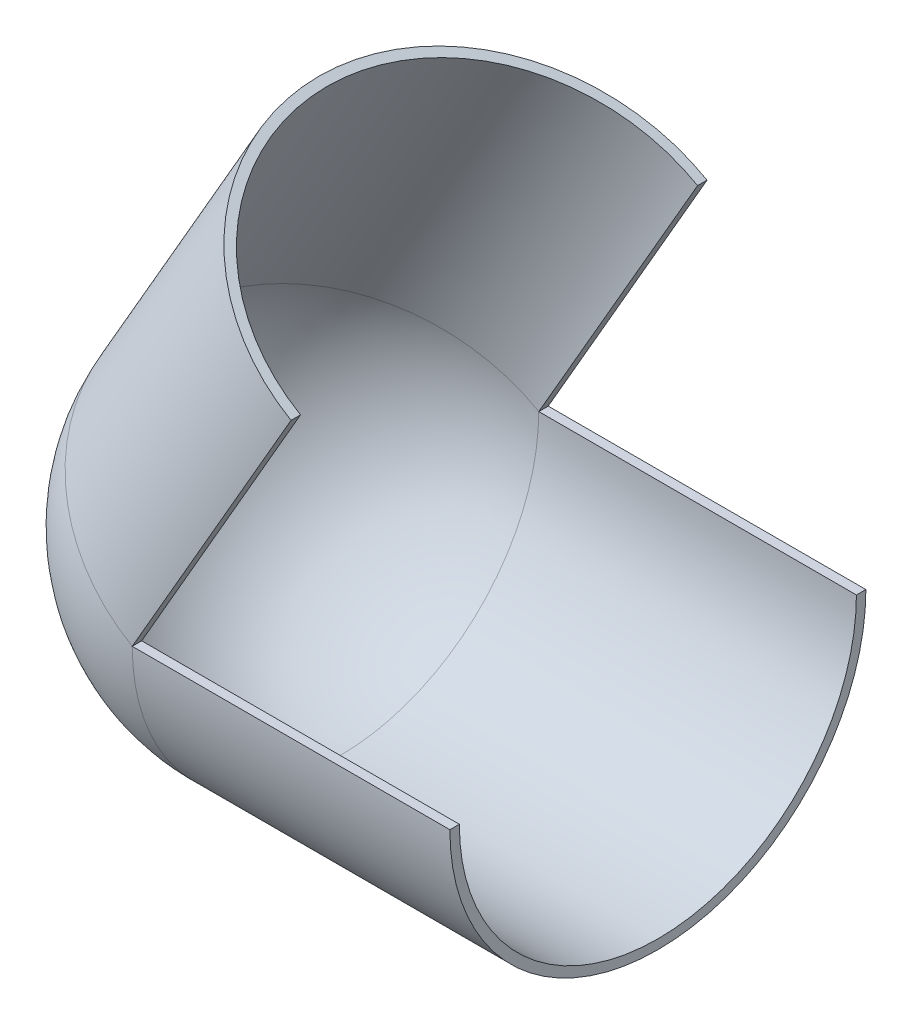
ISO-10303-21;
HEADER;
FILE_DESCRIPTION(('STEP AP214'),'2;1');
FILE_NAME('part.step','',(''),(''),'','','');
FILE_SCHEMA(('AUTOMOTIVE_DESIGN { 1 0 10303 214 1 1 1 1 }'));
ENDSEC;
DATA;
#1=APPLICATION_CONTEXT('core data for automotive mechanical design processes');
#2=APPLICATION_PROTOCOL_DEFINITION('international standard','automotive_design',2000,#1);
#3=PRODUCT_CONTEXT('',#1,'mechanical');
#4=PRODUCT('Part','Part','',(#3));
#5=PRODUCT_RELATED_PRODUCT_CATEGORY('part','',(#4));
#6=PRODUCT_DEFINITION_FORMATION('','',#4);
#7=PRODUCT_DEFINITION_CONTEXT('part definition',#1,'design');
#8=PRODUCT_DEFINITION('design','',#6,#7);
#9=PRODUCT_DEFINITION_SHAPE('','',#8);
#10=(LENGTH_UNIT() NAMED_UNIT(*) SI_UNIT(.MILLI.,.METRE.));
#11=(NAMED_UNIT(*) PLANE_ANGLE_UNIT() SI_UNIT($,.RADIAN.));
#12=(NAMED_UNIT(*) SI_UNIT($,.STERADIAN.) SOLID_ANGLE_UNIT());
#13=UNCERTAINTY_MEASURE_WITH_UNIT(LENGTH_MEASURE(1.E-05),#10,'distance_accuracy_value','');
#14=(GEOMETRIC_REPRESENTATION_CONTEXT(3) GLOBAL_UNCERTAINTY_ASSIGNED_CONTEXT((#13)) GLOBAL_UNIT_ASSIGNED_CONTEXT((#10,
#11,#12)) REPRESENTATION_CONTEXT('',''));
#15=CARTESIAN_POINT('',(0.,0.,0.));
#16=DIRECTION('',(0.,0.,1.));
#17=DIRECTION('',(1.,0.,0.));
#18=AXIS2_PLACEMENT_3D('',#15,#16,#17);
#19=CARTESIAN_POINT('',(0.,0.,0.));
#20=DIRECTION('',(0.,0.,1.));
#21=DIRECTION('',(-0.866025403784436,0.500000000000004,0.));
#22=AXIS2_PLACEMENT_3D('',#19,#20,#21);
#23=SPHERICAL_SURFACE('',#22,127.);
#24=CARTESIAN_POINT('',(0.,0.,0.));
#25=DIRECTION('',(-1.,0.,0.));
#26=DIRECTION('',(0.,0.,1.));
#27=AXIS2_PLACEMENT_3D('',#24,#25,#26);
#28=CIRCLE('',#27,127.);
#29=CARTESIAN_POINT('',(0.,0.,-127.));
#30=VERTEX_POINT('',#29);
#31=CARTESIAN_POINT('',(0.,0.,127.));
#32=VERTEX_POINT('',#31);
#33=EDGE_CURVE('E130',#30,#32,#28,.T.);
#34=ORIENTED_EDGE('',*,*,#33,.F.);
#35=CARTESIAN_POINT('',(0.,0.,0.));
#36=DIRECTION('',(0.500000000000004,0.866025403784436,0.));
#37=DIRECTION('',(0.,0.,1.));
#38=AXIS2_PLACEMENT_3D('',#35,#36,#37);
#39=CIRCLE('',#38,127.);
#40=EDGE_CURVE('E105',#30,#32,#39,.T.);
#41=ORIENTED_EDGE('',*,*,#40,.T.);
#42=EDGE_LOOP('',(#34,#41));
#43=FACE_BOUND('',#42,.T.);
#44=ADVANCED_FACE('F32',(#43),#23,.F.);
#45=CARTESIAN_POINT('',(0.,0.,0.));
#46=DIRECTION('',(0.,0.,1.));
#47=DIRECTION('',(0.866025403784436,-0.500000000000004,0.));
#48=AXIS2_PLACEMENT_3D('',#45,#46,#47);
#49=SPHERICAL_SURFACE('',#48,133.054110976521);
#50=CARTESIAN_POINT('',(0.,0.,0.));
#51=DIRECTION('',(1.,0.,0.));
#52=DIRECTION('',(0.,0.,1.));
#53=AXIS2_PLACEMENT_3D('',#50,#51,#52);
#54=CIRCLE('',#53,133.054110976521);
#55=CARTESIAN_POINT('',(0.,0.,133.054110976521));
#56=VERTEX_POINT('',#55);
#57=CARTESIAN_POINT('',(0.,0.,-133.054110976521));
#58=VERTEX_POINT('',#57);
#59=EDGE_CURVE('E133',#56,#58,#54,.T.);
#60=ORIENTED_EDGE('',*,*,#59,.F.);
#61=CARTESIAN_POINT('',(0.,0.,0.));
#62=DIRECTION('',(-0.500000000000004,-0.866025403784436,0.));
#63=DIRECTION('',(0.,0.,1.));
#64=AXIS2_PLACEMENT_3D('',#61,#62,#63);
#65=CIRCLE('',#64,133.054110976521);
#66=EDGE_CURVE('E41',#56,#58,#65,.T.);
#67=ORIENTED_EDGE('',*,*,#66,.T.);
#68=EDGE_LOOP('',(#60,#67));
#69=FACE_BOUND('',#68,.T.);
#70=ADVANCED_FACE('F34',(#69),#49,.T.);
#71=CARTESIAN_POINT('',(203.2,0.,0.));
#72=DIRECTION('',(-1.,0.,0.));
#73=DIRECTION('',(0.,0.,1.));
#74=AXIS2_PLACEMENT_3D('',#71,#72,#73);
#75=CYLINDRICAL_SURFACE('',#74,127.);
#76=ORIENTED_EDGE('',*,*,#33,.T.);
#77=DIRECTION('',(-1.,0.,0.));
#78=VECTOR('',#77,1.);
#79=CARTESIAN_POINT('',(203.2,0.,127.));
#80=LINE('',#79,#78);
#81=CARTESIAN_POINT('',(203.2,0.,127.));
#82=VERTEX_POINT('',#81);
#83=EDGE_CURVE('E127',#82,#32,#80,.T.);
#84=ORIENTED_EDGE('',*,*,#83,.F.);
#85=CARTESIAN_POINT('',(203.2,0.,0.));
#86=DIRECTION('',(-1.,0.,0.));
#87=DIRECTION('',(0.,0.,-1.));
#88=AXIS2_PLACEMENT_3D('',#85,#86,#87);
#89=CIRCLE('',#88,127.);
#90=CARTESIAN_POINT('',(203.2,0.,-127.));
#91=VERTEX_POINT('',#90);
#92=EDGE_CURVE('E106',#91,#82,#89,.T.);
#93=ORIENTED_EDGE('',*,*,#92,.F.);
#94=DIRECTION('',(-1.,0.,0.));
#95=VECTOR('',#94,1.);
#96=CARTESIAN_POINT('',(203.2,0.,-127.));
#97=LINE('',#96,#95);
#98=EDGE_CURVE('E118',#91,#30,#97,.T.);
#99=ORIENTED_EDGE('',*,*,#98,.T.);
#100=EDGE_LOOP('',(#76,#84,#93,#99));
#101=FACE_BOUND('',#100,.T.);
#102=ADVANCED_FACE('F155',(#101),#75,.F.);
#103=CARTESIAN_POINT('',(203.2,0.,127.));
#104=DIRECTION('',(0.,-1.,0.));
#105=DIRECTION('',(0.,0.,-1.));
#106=AXIS2_PLACEMENT_3D('',#103,#104,#105);
#107=PLANE('',#106);
#108=DIRECTION('',(0.,0.,1.));
#109=VECTOR('',#108,1.);
#110=CARTESIAN_POINT('',(0.,0.,133.054110976521));
#111=LINE('',#110,#109);
#112=EDGE_CURVE('E137',#32,#56,#111,.T.);
#113=ORIENTED_EDGE('',*,*,#112,.T.);
#114=DIRECTION('',(-1.,0.,0.));
#115=VECTOR('',#114,1.);
#116=CARTESIAN_POINT('',(203.2,0.,133.054110976521));
#117=LINE('',#116,#115);
#118=CARTESIAN_POINT('',(203.2,0.,133.054110976521));
#119=VERTEX_POINT('',#118);
#120=EDGE_CURVE('E124',#119,#56,#117,.T.);
#121=ORIENTED_EDGE('',*,*,#120,.F.);
#122=DIRECTION('',(0.,0.,1.));
#123=VECTOR('',#122,1.);
#124=CARTESIAN_POINT('',(203.2,0.,127.));
#125=LINE('',#124,#123);
#126=EDGE_CURVE('E108',#82,#119,#125,.T.);
#127=ORIENTED_EDGE('',*,*,#126,.F.);
#128=ORIENTED_EDGE('',*,*,#83,.T.);
#129=EDGE_LOOP('',(#113,#121,#127,#128));
#130=FACE_BOUND('',#129,.T.);
#131=ADVANCED_FACE('F158',(#130),#107,.F.);
#132=CARTESIAN_POINT('',(203.2,0.,0.));
#133=DIRECTION('',(-1.,0.,0.));
#134=DIRECTION('',(0.,0.,1.));
#135=AXIS2_PLACEMENT_3D('',#132,#133,#134);
#136=CYLINDRICAL_SURFACE('',#135,133.054110976521);
#137=ORIENTED_EDGE('',*,*,#59,.T.);
#138=DIRECTION('',(-1.,0.,0.));
#139=VECTOR('',#138,1.);
#140=CARTESIAN_POINT('',(203.2,0.,-133.054110976521));
#141=LINE('',#140,#139);
#142=CARTESIAN_POINT('',(203.2,0.,-133.054110976521));
#143=VERTEX_POINT('',#142);
#144=EDGE_CURVE('E121',#143,#58,#141,.T.);
#145=ORIENTED_EDGE('',*,*,#144,.F.);
#146=CARTESIAN_POINT('',(203.2,0.,0.));
#147=DIRECTION('',(1.,0.,0.));
#148=DIRECTION('',(0.,0.,-1.));
#149=AXIS2_PLACEMENT_3D('',#146,#147,#148);
#150=CIRCLE('',#149,133.054110976521);
#151=EDGE_CURVE('E115',#119,#143,#150,.T.);
#152=ORIENTED_EDGE('',*,*,#151,.F.);
#153=ORIENTED_EDGE('',*,*,#120,.T.);
#154=EDGE_LOOP('',(#137,#145,#152,#153));
#155=FACE_BOUND('',#154,.T.);
#156=ADVANCED_FACE('F147',(#155),#136,.T.);
#157=CARTESIAN_POINT('',(203.2,0.,-133.054110976521));
#158=DIRECTION('',(0.,-1.,0.));
#159=DIRECTION('',(0.,0.,-1.));
#160=AXIS2_PLACEMENT_3D('',#157,#158,#159);
#161=PLANE('',#160);
#162=DIRECTION('',(0.,0.,1.));
#163=VECTOR('',#162,1.);
#164=CARTESIAN_POINT('',(0.,0.,-127.));
#165=LINE('',#164,#163);
#166=EDGE_CURVE('E11',#58,#30,#165,.T.);
#167=ORIENTED_EDGE('',*,*,#166,.T.);
#168=ORIENTED_EDGE('',*,*,#98,.F.);
#169=DIRECTION('',(0.,0.,1.));
#170=VECTOR('',#169,1.);
#171=CARTESIAN_POINT('',(203.2,0.,-133.054110976521));
#172=LINE('',#171,#170);
#173=EDGE_CURVE('E48',#143,#91,#172,.T.);
#174=ORIENTED_EDGE('',*,*,#173,.F.);
#175=ORIENTED_EDGE('',*,*,#144,.T.);
#176=EDGE_LOOP('',(#167,#168,#174,#175));
#177=FACE_BOUND('',#176,.T.);
#178=ADVANCED_FACE('F151',(#177),#161,.F.);
#179=CARTESIAN_POINT('',(203.2,0.,0.));
#180=DIRECTION('',(1.,0.,0.));
#181=DIRECTION('',(0.,0.,-1.));
#182=AXIS2_PLACEMENT_3D('',#179,#180,#181);
#183=PLANE('',#182);
#184=ORIENTED_EDGE('',*,*,#92,.T.);
#185=ORIENTED_EDGE('',*,*,#126,.T.);
#186=ORIENTED_EDGE('',*,*,#151,.T.);
#187=ORIENTED_EDGE('',*,*,#173,.T.);
#188=EDGE_LOOP('',(#184,#185,#186,#187));
#189=FACE_BOUND('',#188,.T.);
#190=ADVANCED_FACE('F156',(#189),#183,.T.);
#191=CARTESIAN_POINT('',(101.600000000001,175.976362048997,0.));
#192=DIRECTION('',(-0.500000000000004,-0.866025403784436,0.));
#193=DIRECTION('',(0.866025403784436,-0.500000000000004,0.));
#194=AXIS2_PLACEMENT_3D('',#191,#192,#193);
#195=CYLINDRICAL_SURFACE('',#194,127.);
#196=ORIENTED_EDGE('',*,*,#40,.F.);
#197=DIRECTION('',(-0.500000000000004,-0.866025403784436,0.));
#198=VECTOR('',#197,1.);
#199=CARTESIAN_POINT('',(101.600000000001,175.976362048997,-127.));
#200=LINE('',#199,#198);
#201=CARTESIAN_POINT('',(101.600000000001,175.976362048997,-127.));
#202=VERTEX_POINT('',#201);
#203=EDGE_CURVE('E85',#202,#30,#200,.T.);
#204=ORIENTED_EDGE('',*,*,#203,.F.);
#205=CARTESIAN_POINT('',(101.600000000001,175.976362048997,0.));
#206=DIRECTION('',(-0.500000000000004,-0.866025403784436,0.));
#207=DIRECTION('',(-0.866025403784436,0.500000000000004,0.));
#208=AXIS2_PLACEMENT_3D('',#205,#206,#207);
#209=CIRCLE('',#208,127.);
#210=CARTESIAN_POINT('',(101.600000000001,175.976362048997,127.));
#211=VERTEX_POINT('',#210);
#212=EDGE_CURVE('E92',#211,#202,#209,.T.);
#213=ORIENTED_EDGE('',*,*,#212,.F.);
#214=DIRECTION('',(-0.500000000000004,-0.866025403784436,0.));
#215=VECTOR('',#214,1.);
#216=CARTESIAN_POINT('',(101.600000000001,175.976362048997,127.));
#217=LINE('',#216,#215);
#218=EDGE_CURVE('E161',#211,#32,#217,.T.);
#219=ORIENTED_EDGE('',*,*,#218,.T.);
#220=EDGE_LOOP('',(#196,#204,#213,#219));
#221=FACE_BOUND('',#220,.T.);
#222=ADVANCED_FACE('F103',(#221),#195,.F.);
#223=CARTESIAN_POINT('',(101.600000000001,175.976362048997,-127.));
#224=DIRECTION('',(-0.866025403784436,0.500000000000004,0.));
#225=DIRECTION('',(-0.500000000000004,-0.866025403784436,0.));
#226=AXIS2_PLACEMENT_3D('',#223,#224,#225);
#227=PLANE('',#226);
#228=ORIENTED_EDGE('',*,*,#166,.F.);
#229=DIRECTION('',(-0.500000000000004,-0.866025403784436,0.));
#230=VECTOR('',#229,1.);
#231=CARTESIAN_POINT('',(101.600000000001,175.976362048997,-133.054110976521));
#232=LINE('',#231,#230);
#233=CARTESIAN_POINT('',(101.600000000001,175.976362048997,-133.054110976521));
#234=VERTEX_POINT('',#233);
#235=EDGE_CURVE('E88',#234,#58,#232,.T.);
#236=ORIENTED_EDGE('',*,*,#235,.F.);
#237=DIRECTION('',(0.,0.,-1.));
#238=VECTOR('',#237,1.);
#239=CARTESIAN_POINT('',(101.600000000001,175.976362048997,-127.));
#240=LINE('',#239,#238);
#241=EDGE_CURVE('E81',#202,#234,#240,.T.);
#242=ORIENTED_EDGE('',*,*,#241,.F.);
#243=ORIENTED_EDGE('',*,*,#203,.T.);
#244=EDGE_LOOP('',(#228,#236,#242,#243));
#245=FACE_BOUND('',#244,.T.);
#246=ADVANCED_FACE('F83',(#245),#227,.F.);
#247=CARTESIAN_POINT('',(101.600000000001,175.976362048997,0.));
#248=DIRECTION('',(-0.500000000000004,-0.866025403784436,0.));
#249=DIRECTION('',(0.866025403784436,-0.500000000000004,0.));
#250=AXIS2_PLACEMENT_3D('',#247,#248,#249);
#251=CYLINDRICAL_SURFACE('',#250,133.054110976521);
#252=ORIENTED_EDGE('',*,*,#66,.F.);
#253=DIRECTION('',(-0.500000000000004,-0.866025403784436,0.));
#254=VECTOR('',#253,1.);
#255=CARTESIAN_POINT('',(101.600000000001,175.976362048997,133.054110976521));
#256=LINE('',#255,#254);
#257=CARTESIAN_POINT('',(101.600000000001,175.976362048997,133.054110976521));
#258=VERTEX_POINT('',#257);
#259=EDGE_CURVE('E110',#258,#56,#256,.T.);
#260=ORIENTED_EDGE('',*,*,#259,.F.);
#261=CARTESIAN_POINT('',(101.600000000001,175.976362048997,0.));
#262=DIRECTION('',(0.500000000000004,0.866025403784436,0.));
#263=DIRECTION('',(-0.866025403784436,0.500000000000004,0.));
#264=AXIS2_PLACEMENT_3D('',#261,#262,#263);
#265=CIRCLE('',#264,133.054110976521);
#266=EDGE_CURVE('E91',#234,#258,#265,.T.);
#267=ORIENTED_EDGE('',*,*,#266,.F.);
#268=ORIENTED_EDGE('',*,*,#235,.T.);
#269=EDGE_LOOP('',(#252,#260,#267,#268));
#270=FACE_BOUND('',#269,.T.);
#271=ADVANCED_FACE('F183',(#270),#251,.T.);
#272=CARTESIAN_POINT('',(101.600000000001,175.976362048997,133.054110976521));
#273=DIRECTION('',(-0.866025403784436,0.500000000000004,0.));
#274=DIRECTION('',(-0.500000000000004,-0.866025403784436,0.));
#275=AXIS2_PLACEMENT_3D('',#272,#273,#274);
#276=PLANE('',#275);
#277=ORIENTED_EDGE('',*,*,#112,.F.);
#278=ORIENTED_EDGE('',*,*,#218,.F.);
#279=DIRECTION('',(0.,0.,-1.));
#280=VECTOR('',#279,1.);
#281=CARTESIAN_POINT('',(101.600000000001,175.976362048997,133.054110976521));
#282=LINE('',#281,#280);
#283=EDGE_CURVE('E97',#258,#211,#282,.T.);
#284=ORIENTED_EDGE('',*,*,#283,.F.);
#285=ORIENTED_EDGE('',*,*,#259,.T.);
#286=EDGE_LOOP('',(#277,#278,#284,#285));
#287=FACE_BOUND('',#286,.T.);
#288=ADVANCED_FACE('F160',(#287),#276,.F.);
#289=CARTESIAN_POINT('',(101.600000000001,175.976362048997,0.));
#290=DIRECTION('',(0.500000000000004,0.866025403784436,0.));
#291=DIRECTION('',(-0.866025403784436,0.500000000000004,0.));
#292=AXIS2_PLACEMENT_3D('',#289,#290,#291);
#293=PLANE('',#292);
#294=ORIENTED_EDGE('',*,*,#212,.T.);
#295=ORIENTED_EDGE('',*,*,#241,.T.);
#296=ORIENTED_EDGE('',*,*,#266,.T.);
#297=ORIENTED_EDGE('',*,*,#283,.T.);
#298=EDGE_LOOP('',(#294,#295,#296,#297));
#299=FACE_BOUND('',#298,.T.);
#300=ADVANCED_FACE('F95',(#299),#293,.T.);
#301=CLOSED_SHELL('',(#44,#70,#102,#131,#156,#178,#190,#222,#246,#271,#288,#300));
#302=MANIFOLD_SOLID_BREP('B2',#301);
#303=ADVANCED_BREP_SHAPE_REPRESENTATION('',(#18,#302),#14);
#304=SHAPE_DEFINITION_REPRESENTATION(#9,#303);
ENDSEC;
END-ISO-10303-21;
